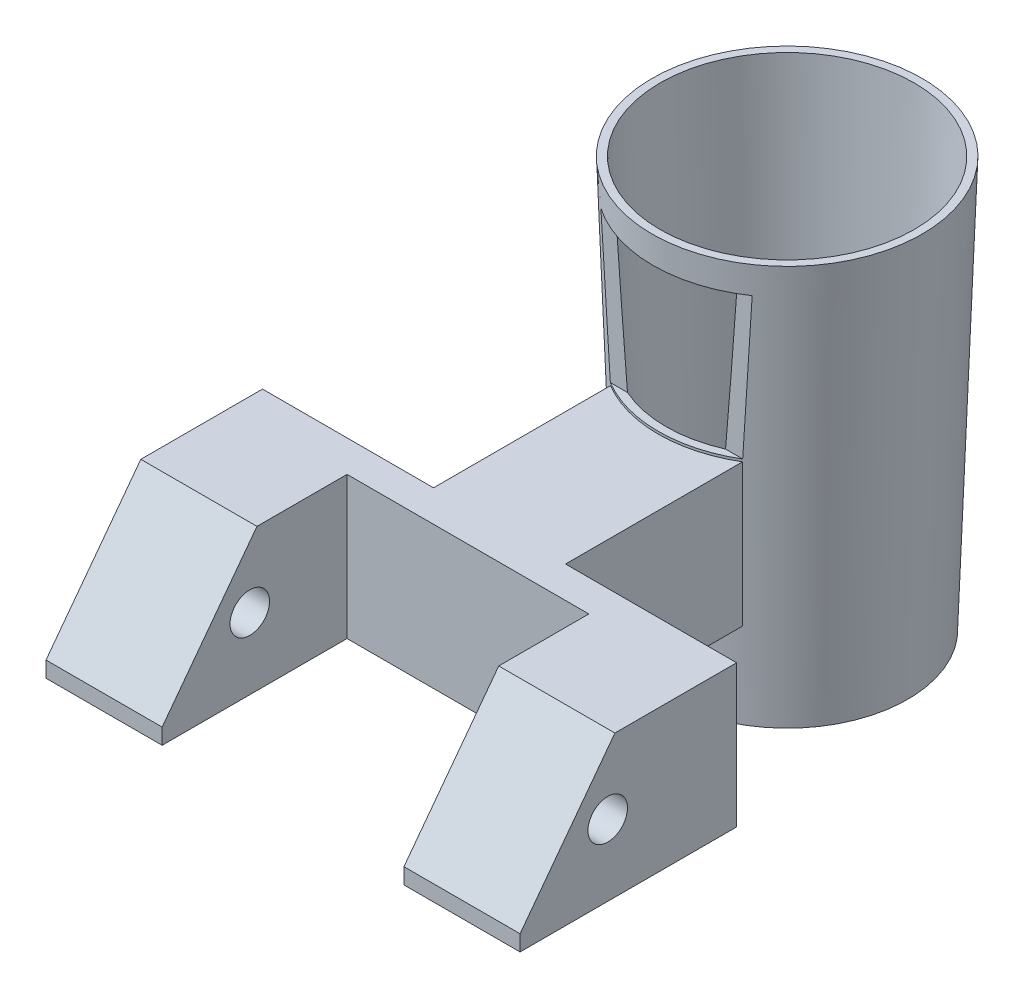
ISO-10303-21;
HEADER;
FILE_DESCRIPTION(('STEP AP214'),'2;1');
FILE_NAME('part.step','',(''),(''),'','','');
FILE_SCHEMA(('AUTOMOTIVE_DESIGN { 1 0 10303 214 1 1 1 1 }'));
ENDSEC;
DATA;
#1=APPLICATION_CONTEXT('core data for automotive mechanical design processes');
#2=APPLICATION_PROTOCOL_DEFINITION('international standard','automotive_design',2000,#1);
#3=PRODUCT_CONTEXT('',#1,'mechanical');
#4=PRODUCT('Part','Part','',(#3));
#5=PRODUCT_RELATED_PRODUCT_CATEGORY('part','',(#4));
#6=PRODUCT_DEFINITION_FORMATION('','',#4);
#7=PRODUCT_DEFINITION_CONTEXT('part definition',#1,'design');
#8=PRODUCT_DEFINITION('design','',#6,#7);
#9=PRODUCT_DEFINITION_SHAPE('','',#8);
#10=(LENGTH_UNIT() NAMED_UNIT(*) SI_UNIT(.MILLI.,.METRE.));
#11=(NAMED_UNIT(*) PLANE_ANGLE_UNIT() SI_UNIT($,.RADIAN.));
#12=(NAMED_UNIT(*) SI_UNIT($,.STERADIAN.) SOLID_ANGLE_UNIT());
#13=UNCERTAINTY_MEASURE_WITH_UNIT(LENGTH_MEASURE(1.E-05),#10,'distance_accuracy_value','');
#14=(GEOMETRIC_REPRESENTATION_CONTEXT(3) GLOBAL_UNCERTAINTY_ASSIGNED_CONTEXT((#13)) GLOBAL_UNIT_ASSIGNED_CONTEXT((#10,
#11,#12)) REPRESENTATION_CONTEXT('',''));
#15=CARTESIAN_POINT('',(0.,0.,0.));
#16=DIRECTION('',(0.,0.,1.));
#17=DIRECTION('',(1.,0.,0.));
#18=AXIS2_PLACEMENT_3D('',#15,#16,#17);
#19=CARTESIAN_POINT('',(0.,0.,0.));
#20=DIRECTION('',(0.,1.,0.));
#21=DIRECTION('',(0.,0.,1.));
#22=AXIS2_PLACEMENT_3D('',#19,#20,#21);
#23=CONICAL_SURFACE('',#22,7.635,0.0349065850398867);
#24=CARTESIAN_POINT('',(0.,0.,0.));
#25=DIRECTION('',(0.,1.,0.));
#26=DIRECTION('',(0.,0.,1.));
#27=AXIS2_PLACEMENT_3D('',#24,#25,#26);
#28=CIRCLE('',#27,7.635);
#29=CARTESIAN_POINT('',(0.,0.,7.635));
#30=VERTEX_POINT('',#29);
#31=EDGE_CURVE('E326',#30,#30,#28,.T.);
#32=ORIENTED_EDGE('',*,*,#31,.T.);
#33=EDGE_LOOP('',(#32));
#34=FACE_BOUND('',#33,.T.);
#35=CARTESIAN_POINT('',(0.,14.79,0.));
#36=DIRECTION('',(0.,-1.,0.));
#37=DIRECTION('',(1.,0.,0.));
#38=AXIS2_PLACEMENT_3D('',#35,#36,#37);
#39=CIRCLE('',#38,8.15147818078295);
#40=CARTESIAN_POINT('',(4.1769123203367,14.79,7.));
#41=VERTEX_POINT('',#40);
#42=CARTESIAN_POINT('',(-4.1769123203367,14.79,7.));
#43=VERTEX_POINT('',#42);
#44=EDGE_CURVE('E359',#41,#43,#39,.T.);
#45=ORIENTED_EDGE('',*,*,#44,.F.);
#46=CARTESIAN_POINT('',(5.37883442278189,34.1602535875309,7.));
#47=CARTESIAN_POINT('',(5.29746098356204,32.7407242724652,7.));
#48=CARTESIAN_POINT('',(5.21496114594843,31.3212586863056,7.));
#49=CARTESIAN_POINT('',(5.04729290213536,28.4825339602092,7.));
#50=CARTESIAN_POINT('',(4.96212458726724,27.0632748148733,7.));
#51=CARTESIAN_POINT('',(4.78871264399351,24.2251827522536,7.));
#52=CARTESIAN_POINT('',(4.7004695334231,22.8063498034009,7.));
#53=CARTESIAN_POINT('',(4.5203274278199,19.9688678004449,7.));
#54=CARTESIAN_POINT('',(4.4284283107347,18.5502187540698,7.));
#55=CARTESIAN_POINT('',(4.24927470403535,15.8494227541624,7.));
#56=CARTESIAN_POINT('',(4.16242159366316,14.5672492270207,7.));
#57=CARTESIAN_POINT('',(3.98439970388387,12.0032100910948,7.));
#58=CARTESIAN_POINT('',(3.89323095591583,10.7213444801359,7.));
#59=CARTESIAN_POINT('',(3.70559419094412,8.15812844056728,7.));
#60=CARTESIAN_POINT('',(3.60912670275801,6.87677797335663,7.));
#61=CARTESIAN_POINT('',(3.4094893345377,4.31455728837519,7.));
#62=CARTESIAN_POINT('',(3.30631926086852,3.03368708555518,7.));
#63=CARTESIAN_POINT('',(3.14490659315583,1.11268015645343,7.));
#64=CARTESIAN_POINT('',(3.08998097714758,0.47226455013285,7.));
#65=CARTESIAN_POINT('',(2.97752462570052,-0.808335924270768,7.));
#66=CARTESIAN_POINT('',(2.91999390122098,-1.44852079331306,7.));
#67=CARTESIAN_POINT('',(2.80184234342515,-2.72855314208155,7.));
#68=CARTESIAN_POINT('',(2.74122176408497,-3.36840064518408,7.));
#69=CARTESIAN_POINT('',(2.61622206619186,-4.64774020631093,7.));
#70=CARTESIAN_POINT('',(2.55184288938958,-5.28723225867147,7.));
#71=CARTESIAN_POINT('',(2.41836974442101,-6.56598144606362,7.));
#72=CARTESIAN_POINT('',(2.34927392317814,-7.20523838840256,7.));
#73=CARTESIAN_POINT('',(2.20504098782717,-8.48305158098413,7.));
#74=CARTESIAN_POINT('',(2.12990412848987,-9.12160785962603,7.));
#75=CARTESIAN_POINT('',(2.01100265117013,-10.0787662382972,7.));
#76=CARTESIAN_POINT('',(1.97032982218827,-10.3977522569865,7.));
#77=CARTESIAN_POINT('',(1.88649120217191,-11.035392693818,7.));
#78=CARTESIAN_POINT('',(1.84332544795816,-11.3540471167871,7.));
#79=CARTESIAN_POINT('',(1.75396275927731,-11.9909799684747,7.));
#80=CARTESIAN_POINT('',(1.70776540150287,-12.309258338341,7.));
#81=CARTESIAN_POINT('',(1.61145697108661,-12.9452369798296,7.));
#82=CARTESIAN_POINT('',(1.56134570077368,-13.2629372214234,7.));
#83=CARTESIAN_POINT('',(1.50883577184699,-13.5802535875309,7.));
#84=B_SPLINE_CURVE_WITH_KNOTS('',3,(#46,#47,#48,#49,#50,#51,#52,#53,#54,#55,#56,#57,#58,#59,#60,
#61,#62,#63,#64,#65,#66,#67,#68,#69,#70,#71,#72,#73,#74,#75,#76,#77,#78,#79,#80,#81,#82,#83),
.UNSPECIFIED.,.F.,.F.,(4,2,2,2,2,2,2,2,2,2,2,2,2,2,2,2,2,2,4),(0.,4.26558001934516,
8.53101420402291,12.7957334740338,17.0605952374343,20.915924909792,24.7712265007152,
28.626144026788,32.4811729694321,34.40946879116,36.3377565016059,38.2658859678164,
40.1940453233955,42.1229666238718,44.0518066179089,45.0165045711355,45.9811882793169,
46.9460069755262,47.9108744311906),.UNSPECIFIED.);
#85=CARTESIAN_POINT('',(3.52442431796431,5.78999999999999,7.));
#86=VERTEX_POINT('',#85);
#87=EDGE_CURVE('E351',#41,#86,#84,.T.);
#88=ORIENTED_EDGE('',*,*,#87,.T.);
#89=CARTESIAN_POINT('',(0.,5.78999999999999,0.));
#90=DIRECTION('',(0.,1.,0.));
#91=DIRECTION('',(-1.,0.,0.));
#92=AXIS2_PLACEMENT_3D('',#89,#90,#91);
#93=CIRCLE('',#92,7.83719125535722);
#94=CARTESIAN_POINT('',(-3.52442431796282,5.78999999999999,7.));
#95=VERTEX_POINT('',#94);
#96=EDGE_CURVE('E337',#95,#86,#93,.T.);
#97=ORIENTED_EDGE('',*,*,#96,.F.);
#98=CARTESIAN_POINT('',(-1.50883577184698,-13.5802535875309,7.));
#99=CARTESIAN_POINT('',(-1.55602216176977,-13.2952395190284,7.));
#100=CARTESIAN_POINT('',(-1.6012460038336,-13.009910606212,7.));
#101=CARTESIAN_POINT('',(-1.68845756310765,-12.438769396071,7.));
#102=CARTESIAN_POINT('',(-1.7304454142854,-12.1529571192584,7.));
#103=CARTESIAN_POINT('',(-1.85258390689214,-11.2950496117438,7.));
#104=CARTESIAN_POINT('',(-1.92892076121249,-10.7224134874774,7.));
#105=CARTESIAN_POINT('',(-2.0744625602636,-9.57640578603929,7.));
#106=CARTESIAN_POINT('',(-2.14366940961348,-9.00303444691441,7.));
#107=CARTESIAN_POINT('',(-2.27674125561708,-7.85565376218701,7.));
#108=CARTESIAN_POINT('',(-2.34060605472457,-7.28164439378515,7.));
#109=CARTESIAN_POINT('',(-2.46413203313391,-6.13337054447066,7.));
#110=CARTESIAN_POINT('',(-2.52379461250638,-5.55910621328909,7.));
#111=CARTESIAN_POINT('',(-2.63972968578688,-4.41024484261137,7.));
#112=CARTESIAN_POINT('',(-2.69600222628913,-3.83564780779769,7.));
#113=CARTESIAN_POINT('',(-2.86064487696454,-2.11135528700942,7.));
#114=CARTESIAN_POINT('',(-2.96482927116652,-0.961260437099898,7.));
#115=CARTESIAN_POINT('',(-3.1879967669894,1.60209839237247,7.));
#116=CARTESIAN_POINT('',(-3.30493307467981,3.01553863508,7.));
#117=CARTESIAN_POINT('',(-3.52999096306747,5.84312324494056,7.));
#118=CARTESIAN_POINT('',(-3.6381124941587,7.25726761601108,7.));
#119=CARTESIAN_POINT('',(-3.84760644774248,10.0860313034585,7.));
#120=CARTESIAN_POINT('',(-3.94897897598211,11.5006506120445,7.));
#121=CARTESIAN_POINT('',(-4.14637328565409,14.3302628990195,7.));
#122=CARTESIAN_POINT('',(-4.24239506002077,15.7452558778994,7.));
#123=CARTESIAN_POINT('',(-4.43014966945764,18.5766324529857,7.));
#124=CARTESIAN_POINT('',(-4.52187910569587,19.9930162739029,7.));
#125=CARTESIAN_POINT('',(-4.70169923826078,22.8260160401418,7.));
#126=CARTESIAN_POINT('',(-4.78978993028103,24.2426319857363,7.));
#127=CARTESIAN_POINT('',(-4.9628905668092,27.0759951109033,7.));
#128=CARTESIAN_POINT('',(-5.04790063365887,28.4927422830192,7.));
#129=CARTESIAN_POINT('',(-5.2152594465338,31.32638965791,7.));
#130=CARTESIAN_POINT('',(-5.29760820057183,32.7432898602112,7.));
#131=CARTESIAN_POINT('',(-5.37883442278189,34.1602535875309,7.));
#132=B_SPLINE_CURVE_WITH_KNOTS('',3,(#98,#99,#100,#101,#102,#103,#104,#105,#106,#107,#108,#109,
#110,#111,#112,#113,#114,#115,#116,#117,#118,#119,#120,#121,#122,#123,#124,#125,#126,#127,#128,
#129,#130,#131),.UNSPECIFIED.,.F.,.F.,(4,2,2,2,2,2,2,2,2,2,2,2,2,2,2,2,4),(0.,0.866659560095629,
1.73328322186169,3.46631723518571,5.19888710085042,6.93152100774515,8.66357488820031,
10.3956049570943,13.8599729293334,18.1147437473273,22.3695385078106,26.6242665861364,
30.8790002826984,35.1370479167216,39.3951005899882,43.6529839762726,47.9108545415854),.UNSPECIFIED.);
#133=EDGE_CURVE('E329',#95,#43,#132,.T.);
#134=ORIENTED_EDGE('',*,*,#133,.T.);
#135=EDGE_LOOP('',(#45,#88,#97,#134));
#136=FACE_BOUND('',#135,.T.);
#137=CARTESIAN_POINT('',(0.,24.2,0.));
#138=DIRECTION('',(0.,1.,0.));
#139=DIRECTION('',(0.,0.,1.));
#140=AXIS2_PLACEMENT_3D('',#137,#138,#139);
#141=CIRCLE('',#140,8.4800826217003);
#142=CARTESIAN_POINT('',(-4.78662733778841,24.2,7.));
#143=VERTEX_POINT('',#142);
#144=CARTESIAN_POINT('',(4.78662733778841,24.2,7.));
#145=VERTEX_POINT('',#144);
#146=EDGE_CURVE('E183',#143,#145,#141,.T.);
#147=ORIENTED_EDGE('',*,*,#146,.T.);
#148=CARTESIAN_POINT('',(5.90903726604226,43.6876697173291,7.));
#149=CARTESIAN_POINT('',(5.82927452718889,42.2144923770276,7.));
#150=CARTESIAN_POINT('',(5.74859060681913,40.7413644553389,7.));
#151=CARTESIAN_POINT('',(5.58508775728723,37.7952366223781,7.));
#152=CARTESIAN_POINT('',(5.50226884178508,36.3222367103475,7.));
#153=CARTESIAN_POINT('',(5.33420688243076,33.3764547842505,7.));
#154=CARTESIAN_POINT('',(5.24896396976119,31.903672762712,7.));
#155=CARTESIAN_POINT('',(5.07566921503719,28.9582636812261,7.));
#156=CARTESIAN_POINT('',(4.98761735399094,27.4856366223941,7.));
#157=CARTESIAN_POINT('',(4.8203146257254,24.7390115899212,7.));
#158=CARTESIAN_POINT('',(4.74147669383163,23.4649884891984,7.));
#159=CARTESIAN_POINT('',(4.58094815703255,20.9171223909377,7.));
#160=CARTESIAN_POINT('',(4.49925755374465,19.6432793932982,7.));
#161=CARTESIAN_POINT('',(4.33252718689738,17.0958335753812,7.));
#162=CARTESIAN_POINT('',(4.24748747948795,15.8222307514364,7.));
#163=CARTESIAN_POINT('',(4.0734086452245,13.2752939924323,7.));
#164=CARTESIAN_POINT('',(3.98436950717787,12.0019600581355,7.));
#165=CARTESIAN_POINT('',(3.80140844295532,9.45551147882899,7.));
#166=CARTESIAN_POINT('',(3.70748601936418,8.1823968694638,7.));
#167=CARTESIAN_POINT('',(3.51355980631857,5.63663733657636,7.));
#168=CARTESIAN_POINT('',(3.41355606482392,4.36399240942961,7.));
#169=CARTESIAN_POINT('',(3.2576258747578,2.45546916034638,7.));
#170=CARTESIAN_POINT('',(3.20465995823647,1.81934879237473,7.));
#171=CARTESIAN_POINT('',(3.09642880568784,0.547304716577795,7.));
#172=CARTESIAN_POINT('',(3.04116357483892,-0.0886189916871519,7.));
#173=CARTESIAN_POINT('',(2.92794649583294,-1.36024496158976,7.));
#174=CARTESIAN_POINT('',(2.8699945777267,-1.99594721702717,7.));
#175=CARTESIAN_POINT('',(2.75084107936115,-3.26705157522272,7.));
#176=CARTESIAN_POINT('',(2.68963947398039,-3.9024536756222,7.));
#177=CARTESIAN_POINT('',(2.62653127668727,-4.53766971732903,7.));
#178=B_SPLINE_CURVE_WITH_KNOTS('',3,(#148,#149,#150,#151,#152,#153,#154,#155,#156,#157,#158,
#159,#160,#161,#162,#163,#164,#165,#166,#167,#168,#169,#170,#171,#172,#173,#174,#175,#176,#177),
.UNSPECIFIED.,.F.,.F.,(4,2,2,2,2,2,2,2,2,2,2,2,2,2,4),(0.,4.42600560504965,8.85198289893749,
13.2777211206273,17.7034892718863,21.5328667632259,25.3622420834158,29.1915532289077,
33.0208750915918,36.850587779039,40.6802702676741,42.5952318236067,44.5101890670106,
46.4251961952746,48.3402181295122),.UNSPECIFIED.);
#179=CARTESIAN_POINT('',(4.1878058258403,14.95,7.));
#180=VERTEX_POINT('',#179);
#181=EDGE_CURVE('E222',#145,#180,#178,.T.);
#182=ORIENTED_EDGE('',*,*,#181,.T.);
#183=CARTESIAN_POINT('',(0.,14.95,0.));
#184=DIRECTION('',(0.,1.,0.));
#185=DIRECTION('',(0.,0.,1.));
#186=AXIS2_PLACEMENT_3D('',#183,#184,#185);
#187=CIRCLE('',#186,8.15706550390163);
#188=CARTESIAN_POINT('',(-4.1878058258403,14.95,7.));
#189=VERTEX_POINT('',#188);
#190=EDGE_CURVE('E229',#189,#180,#187,.T.);
#191=ORIENTED_EDGE('',*,*,#190,.F.);
#192=CARTESIAN_POINT('',(-2.62653127668727,-4.53766971732904,7.));
#193=CARTESIAN_POINT('',(-2.68607058392794,-3.93845739943373,7.));
#194=CARTESIAN_POINT('',(-2.74390243650488,-3.33907856182433,7.));
#195=CARTESIAN_POINT('',(-2.85664456223595,-2.14004992826851,7.));
#196=CARTESIAN_POINT('',(-2.91155485546768,-1.54040013421273,7.));
#197=CARTESIAN_POINT('',(-3.0726417715624,0.258843684971118,7.));
#198=CARTESIAN_POINT('',(-3.17517748029637,1.45876336108969,7.));
#199=CARTESIAN_POINT('',(-3.3730121623862,3.85910475639119,7.));
#200=CARTESIAN_POINT('',(-3.46831166537692,5.0595264323524,7.));
#201=CARTESIAN_POINT('',(-3.65325816417285,7.46081322794196,7.));
#202=CARTESIAN_POINT('',(-3.74290511475023,8.66167835104116,7.));
#203=CARTESIAN_POINT('',(-3.93272452098877,11.2709094087475,7.));
#204=CARTESIAN_POINT('',(-4.0320451810046,12.6793371237031,7.));
#205=CARTESIAN_POINT('',(-4.22567968705454,15.4965373624124,7.));
#206=CARTESIAN_POINT('',(-4.31999352465027,16.9053098867432,7.));
#207=CARTESIAN_POINT('',(-4.59682171099864,21.1320431314302,7.));
#208=CARTESIAN_POINT('',(-4.77322167387813,23.9504046663204,7.));
#209=CARTESIAN_POINT('',(-5.02914713349657,28.1787237861839,7.));
#210=CARTESIAN_POINT('',(-5.11301719578763,29.5884228026679,7.));
#211=CARTESIAN_POINT('',(-5.27822389296497,32.4079703311838,7.));
#212=CARTESIAN_POINT('',(-5.35956052687596,33.817818843273,7.));
#213=CARTESIAN_POINT('',(-5.52003430279725,36.63760700688,7.));
#214=CARTESIAN_POINT('',(-5.59917149709902,38.0475466554309,7.));
#215=CARTESIAN_POINT('',(-5.75550042516701,40.8675322550092,7.));
#216=CARTESIAN_POINT('',(-5.83269216114003,42.2775782059142,7.));
#217=CARTESIAN_POINT('',(-5.90903726604248,43.6876697173291,7.));
#218=B_SPLINE_CURVE_WITH_KNOTS('',3,(#192,#193,#194,#195,#196,#197,#198,#199,#200,#201,#202,
#203,#204,#205,#206,#207,#208,#209,#210,#211,#212,#213,#214,#215,#216,#217),.UNSPECIFIED.,.F.,
.F.,(4,2,2,2,2,2,2,2,2,2,2,2,4),(0.,1.80648197496649,3.61295153379343,7.22579656697551,
10.838376912155,14.4509861590413,18.6867507044866,22.9225223885524,31.3941104405834,
35.6306847424603,39.8672606752886,44.1037357976077,48.3402061141009),.UNSPECIFIED.);
#219=EDGE_CURVE('E216',#189,#143,#218,.T.);
#220=ORIENTED_EDGE('',*,*,#219,.T.);
#221=EDGE_LOOP('',(#147,#182,#191,#220));
#222=FACE_BOUND('',#221,.T.);
#223=CARTESIAN_POINT('',(0.,25.95,0.));
#224=DIRECTION('',(0.,1.,0.));
#225=DIRECTION('',(0.,0.,1.));
#226=AXIS2_PLACEMENT_3D('',#223,#224,#225);
#227=CIRCLE('',#226,8.54119396831085);
#228=CARTESIAN_POINT('',(0.,25.95,8.54119396831085));
#229=VERTEX_POINT('',#228);
#230=EDGE_CURVE('E429',#229,#229,#227,.T.);
#231=ORIENTED_EDGE('',*,*,#230,.F.);
#232=EDGE_LOOP('',(#231));
#233=FACE_BOUND('',#232,.T.);
#234=ADVANCED_FACE('F41',(#34,#136,#222,#233),#23,.T.);
#235=CARTESIAN_POINT('',(0.,0.,0.));
#236=DIRECTION('',(0.,1.,0.));
#237=DIRECTION('',(0.,0.,-1.));
#238=AXIS2_PLACEMENT_3D('',#235,#236,#237);
#239=CONICAL_SURFACE('',#238,7.135,0.0349065850398867);
#240=CARTESIAN_POINT('',(0.,0.,0.));
#241=DIRECTION('',(0.,-1.,0.));
#242=DIRECTION('',(0.,0.,-1.));
#243=AXIS2_PLACEMENT_3D('',#240,#241,#242);
#244=CIRCLE('',#243,7.135);
#245=CARTESIAN_POINT('',(0.,0.,-7.135));
#246=VERTEX_POINT('',#245);
#247=EDGE_CURVE('E301',#246,#246,#244,.T.);
#248=ORIENTED_EDGE('',*,*,#247,.T.);
#249=EDGE_LOOP('',(#248));
#250=FACE_BOUND('',#249,.T.);
#251=CARTESIAN_POINT('',(0.,24.2,0.));
#252=DIRECTION('',(0.,1.,0.));
#253=DIRECTION('',(0.,0.,1.));
#254=AXIS2_PLACEMENT_3D('',#251,#252,#253);
#255=CIRCLE('',#254,7.9800826217003);
#256=CARTESIAN_POINT('',(3.83167308745973,24.2,7.));
#257=VERTEX_POINT('',#256);
#258=CARTESIAN_POINT('',(-3.83167308745971,24.2,7.));
#259=VERTEX_POINT('',#258);
#260=EDGE_CURVE('E50',#257,#259,#255,.F.);
#261=ORIENTED_EDGE('',*,*,#260,.T.);
#262=CARTESIAN_POINT('',(-5.11666877866556,43.9754736716612,7.));
#263=CARTESIAN_POINT('',(-5.03417828983914,42.5818487224281,7.));
#264=CARTESIAN_POINT('',(-4.95043234100004,41.1882969203125,7.));
#265=CARTESIAN_POINT('',(-4.77991886640762,38.4013690833985,7.));
#266=CARTESIAN_POINT('',(-4.69315132059315,37.0079930498288,7.));
#267=CARTESIAN_POINT('',(-4.5160435329219,34.2208109424071,7.));
#268=CARTESIAN_POINT('',(-4.4257016336801,32.8270049735748,7.));
#269=CARTESIAN_POINT('',(-4.24077681623447,30.0396789378694,7.));
#270=CARTESIAN_POINT('',(-4.14619391427884,28.6461588699216,7.));
#271=CARTESIAN_POINT('',(-3.95184081113525,25.8594649117255,7.));
#272=CARTESIAN_POINT('',(-3.85207055667136,24.4662910251803,7.));
#273=CARTESIAN_POINT('',(-3.6460192403796,21.680407559475,7.));
#274=CARTESIAN_POINT('',(-3.539738112545,20.2876979851658,7.));
#275=CARTESIAN_POINT('',(-3.31873132501089,17.5034340769784,7.));
#276=CARTESIAN_POINT('',(-3.20400861741535,16.1118795097274,7.));
#277=CARTESIAN_POINT('',(-2.96305291648762,13.3297866050293,7.));
#278=CARTESIAN_POINT('',(-2.83682023249379,11.9392482412828,7.));
#279=CARTESIAN_POINT('',(-2.63464344133439,9.8547276212309,7.));
#280=CARTESIAN_POINT('',(-2.56511564697109,9.16012410987599,7.));
#281=CARTESIAN_POINT('',(-2.42057982307696,7.77145349654154,7.));
#282=CARTESIAN_POINT('',(-2.3455715681567,7.07738641781093,7.));
#283=CARTESIAN_POINT('',(-2.18825961340254,5.68948772278251,7.));
#284=CARTESIAN_POINT('',(-2.10594986088908,4.99565678960218,7.));
#285=CARTESIAN_POINT('',(-1.93128093384789,3.60930370265913,7.));
#286=CARTESIAN_POINT('',(-1.83892283101782,2.91678141732327,7.));
#287=CARTESIAN_POINT('',(-1.68859170257032,1.87929462877397,7.));
#288=CARTESIAN_POINT('',(-1.63648220748541,1.53348277251955,7.));
#289=CARTESIAN_POINT('',(-1.52704244911602,0.842607241864959,7.));
#290=CARTESIAN_POINT('',(-1.46971121899624,0.497543718181638,7.));
#291=CARTESIAN_POINT('',(-1.34786569763911,-0.190787764498165,7.));
#292=CARTESIAN_POINT('',(-1.28336215940785,-0.534057624734358,7.));
#293=CARTESIAN_POINT('',(-1.14359131443542,-1.21837440849487,7.));
#294=CARTESIAN_POINT('',(-1.06832822000585,-1.55942214759035,7.));
#295=CARTESIAN_POINT('',(-0.946978553776577,-2.04242476096203,7.));
#296=CARTESIAN_POINT('',(-0.90891613799513,-2.18637898068216,7.));
#297=CARTESIAN_POINT('',(-0.827641282185499,-2.47302533097029,7.));
#298=CARTESIAN_POINT('',(-0.784423469368128,-2.61571597540475,7.));
#299=CARTESIAN_POINT('',(-0.702053630808244,-2.86273267848493,7.));
#300=CARTESIAN_POINT('',(-0.664640177432231,-2.96762980483337,7.));
#301=CARTESIAN_POINT('',(-0.583273434433754,-3.17463432869664,7.));
#302=CARTESIAN_POINT('',(-0.53933649312213,-3.27674796560979,7.));
#303=CARTESIAN_POINT('',(-0.454171880086386,-3.44701074247862,7.));
#304=CARTESIAN_POINT('',(-0.415787452089309,-3.5164947650084,7.));
#305=CARTESIAN_POINT('',(-0.348445550716391,-3.61883113246573,7.));
#306=CARTESIAN_POINT('',(-0.323090184408978,-3.65402335756155,7.));
#307=CARTESIAN_POINT('',(-0.267909401946419,-3.72070658570461,7.));
#308=CARTESIAN_POINT('',(-0.23810802108945,-3.75221595776443,7.));
#309=CARTESIAN_POINT('',(-0.191674243598371,-3.79111652796179,7.));
#310=CARTESIAN_POINT('',(-0.177755917768095,-3.80170342462956,7.));
#311=CARTESIAN_POINT('',(-0.148700262564743,-3.82110442927483,7.));
#312=CARTESIAN_POINT('',(-0.133562480274437,-3.8299178742856,7.));
#313=CARTESIAN_POINT('',(-0.101843877070575,-3.84519914831173,7.));
#314=CARTESIAN_POINT('',(-0.0852456310845947,-3.85163192751516,7.));
#315=CARTESIAN_POINT('',(-0.051121907425573,-3.86113825415337,7.));
#316=CARTESIAN_POINT('',(-0.0335991708672691,-3.86422120499276,7.));
#317=CARTESIAN_POINT('',(-0.000325235230056778,-3.86639424052118,7.));
#318=CARTESIAN_POINT('',(0.0153987139210061,-3.86590162249542,7.));
#319=CARTESIAN_POINT('',(0.0464791481731649,-3.86197091046338,7.));
#320=CARTESIAN_POINT('',(0.0618351682627628,-3.85852927233564,7.));
#321=CARTESIAN_POINT('',(0.0945616651476857,-3.84825251184257,7.));
#322=CARTESIAN_POINT('',(0.11176575147456,-3.84089973961769,7.));
#323=CARTESIAN_POINT('',(0.14479044822671,-3.82357754402476,7.));
#324=CARTESIAN_POINT('',(0.160608139537085,-3.81360276840934,7.));
#325=CARTESIAN_POINT('',(0.202618124645821,-3.78342113880434,7.));
#326=CARTESIAN_POINT('',(0.227385524937116,-3.76126250209628,7.));
#327=CARTESIAN_POINT('',(0.273690197049849,-3.713825871504,7.));
#328=CARTESIAN_POINT('',(0.295216446101029,-3.68853774305385,7.));
#329=CARTESIAN_POINT('',(0.348994454727748,-3.61922041520392,7.));
#330=CARTESIAN_POINT('',(0.379204511302802,-3.57362713937133,7.));
#331=CARTESIAN_POINT('',(0.435492302983211,-3.47992179076759,7.));
#332=CARTESIAN_POINT('',(0.461559156969842,-3.43180351306297,7.));
#333=CARTESIAN_POINT('',(0.535693538987555,-3.28482876781454,7.));
#334=CARTESIAN_POINT('',(0.579401544433079,-3.1837961274704,7.));
#335=CARTESIAN_POINT('',(0.667254810653851,-2.96169658497156,7.));
#336=CARTESIAN_POINT('',(0.710180256940603,-2.84017472173018,7.));
#337=CARTESIAN_POINT('',(0.79040634040045,-2.59526263721477,7.));
#338=CARTESIAN_POINT('',(0.82770498353279,-2.47187177056517,7.));
#339=CARTESIAN_POINT('',(0.934015872790759,-2.09952646010261,7.));
#340=CARTESIAN_POINT('',(0.997249653420493,-1.84894641857923,7.));
#341=CARTESIAN_POINT('',(1.11488063765336,-1.34604677382524,7.));
#342=CARTESIAN_POINT('',(1.16928578278263,-1.09372894917737,7.));
#343=CARTESIAN_POINT('',(1.27203693930858,-0.58821764902708,7.));
#344=CARTESIAN_POINT('',(1.32039089158631,-0.335025778838137,7.));
#345=CARTESIAN_POINT('',(1.45838602909781,0.421936210450084,7.));
#346=CARTESIAN_POINT('',(1.54177276241603,0.92683527977775,7.));
#347=CARTESIAN_POINT('',(1.69834271722101,1.93823316943329,7.));
#348=CARTESIAN_POINT('',(1.77152458271177,2.44473219323198,7.));
#349=CARTESIAN_POINT('',(1.91079063479054,3.45915220312167,7.));
#350=CARTESIAN_POINT('',(1.9768685434427,3.96707404648781,7.));
#351=CARTESIAN_POINT('',(2.10371094053635,4.98354469158088,7.));
#352=CARTESIAN_POINT('',(2.1644757314045,5.4920934559498,7.));
#353=CARTESIAN_POINT('',(2.28181082832945,6.50917056611662,7.));
#354=CARTESIAN_POINT('',(2.33838516253953,7.01769844926585,7.));
#355=CARTESIAN_POINT('',(2.44820398041911,8.03511906976006,7.));
#356=CARTESIAN_POINT('',(2.50144841729099,8.54401181213108,7.));
#357=CARTESIAN_POINT('',(2.65704148769098,10.0707037779463,7.));
#358=CARTESIAN_POINT('',(2.75529535601849,11.0889199828394,7.));
#359=CARTESIAN_POINT('',(2.96875159600917,13.39372476215,7.));
#360=CARTESIAN_POINT('',(3.081623168064,14.6805267733005,7.));
#361=CARTESIAN_POINT('',(3.29839798924733,17.2548936384263,7.));
#362=CARTESIAN_POINT('',(3.40230113916566,18.5424585006817,7.));
#363=CARTESIAN_POINT('',(3.6033079965918,21.1183264242279,7.));
#364=CARTESIAN_POINT('',(3.7004105969349,22.4066295714536,7.));
#365=CARTESIAN_POINT('',(3.88922576068111,24.9836318672537,7.));
#366=CARTESIAN_POINT('',(3.98093831173327,26.2723310167288,7.));
#367=CARTESIAN_POINT('',(4.24957136667998,30.1389273334599,7.));
#368=CARTESIAN_POINT('',(4.41998367276578,32.7172761571475,7.));
#369=CARTESIAN_POINT('',(4.74867773869352,37.87461920535,7.));
#370=CARTESIAN_POINT('',(4.90696005438522,40.4536133948515,7.));
#371=CARTESIAN_POINT('',(5.07941554132185,43.3470717461905,7.));
#372=CARTESIAN_POINT('',(5.09807458192774,43.6612708142829,7.));
#373=CARTESIAN_POINT('',(5.11666877866556,43.9754736716612,7.));
#374=B_SPLINE_CURVE_WITH_KNOTS('',3,(#262,#263,#264,#265,#266,#267,#268,#269,#270,#271,#272,
#273,#274,#275,#276,#277,#278,#279,#280,#281,#282,#283,#284,#285,#286,#287,#288,#289,#290,#291,
#292,#293,#294,#295,#296,#297,#298,#299,#300,#301,#302,#303,#304,#305,#306,#307,#308,#309,#310,
#311,#312,#313,#314,#315,#316,#317,#318,#319,#320,#321,#322,#323,#324,#325,#326,#327,#328,#329,
#330,#331,#332,#333,#334,#335,#336,#337,#338,#339,#340,#341,#342,#343,#344,#345,#346,#347,#348,
#349,#350,#351,#352,#353,#354,#355,#356,#357,#358,#359,#360,#361,#362,#363,#364,#365,#366,#367,
#368,#369,#370,#371,#372,#373),.UNSPECIFIED.,.F.,.F.,(4,2,2,2,2,2,2,2,2,2,2,2,2,2,2,2,2,2,2,2,2,
2,2,2,2,2,2,2,2,2,2,2,2,2,2,2,2,2,2,2,2,2,2,2,2,2,2,2,2,2,2,2,2,2,2,4),(0.,4.18819369180081,
8.37641519537589,12.5666020257579,16.7567728040055,20.9469866252775,25.1372429336369,
29.3260407692318,33.5147260612279,35.6089346760658,37.7032294658571,39.7992768709452,
41.8951009427444,42.9442236049229,43.9935409148358,45.0413057350052,46.0886614782145,
46.5353093960031,46.9824269308196,47.3164014415864,47.6495526911815,47.8870634562312,
48.0170222618063,48.1463023874983,48.1986655787368,48.2510483086095,48.3041741653741,
48.3571505025566,48.4040524673661,48.4510108779673,48.5068269371678,48.5627578295841,
48.66189520825,48.7613624749175,48.9250106299632,49.0890817085401,49.4188078556059,
49.8052912596497,50.1919113065355,50.9668884485595,51.7411645726644,52.5144137279371,
54.0494302400757,55.5846505272047,57.1212165619955,58.6576950772773,60.1926769225752,
61.7276803353149,64.7964698374869,68.6716555580393,72.5468841410455,76.4227421717355,
80.2986090833526,88.0504849498974,95.802005378571,96.7462632081477),.UNSPECIFIED.);
#375=CARTESIAN_POINT('',(-3.10332920120317,14.95,7.));
#376=VERTEX_POINT('',#375);
#377=EDGE_CURVE('E11',#259,#376,#374,.T.);
#378=ORIENTED_EDGE('',*,*,#377,.T.);
#379=CARTESIAN_POINT('',(0.,14.95,0.));
#380=DIRECTION('',(0.,1.,0.));
#381=DIRECTION('',(0.,0.,1.));
#382=AXIS2_PLACEMENT_3D('',#379,#380,#381);
#383=CIRCLE('',#382,7.65706550390163);
#384=CARTESIAN_POINT('',(3.10332920120317,14.95,7.));
#385=VERTEX_POINT('',#384);
#386=EDGE_CURVE('E189',#385,#376,#383,.F.);
#387=ORIENTED_EDGE('',*,*,#386,.F.);
#388=EDGE_CURVE('E52',#385,#257,#374,.T.);
#389=ORIENTED_EDGE('',*,*,#388,.T.);
#390=EDGE_LOOP('',(#261,#378,#387,#389));
#391=FACE_BOUND('',#390,.T.);
#392=CARTESIAN_POINT('',(0.,25.95,0.));
#393=DIRECTION('',(0.,1.,0.));
#394=DIRECTION('',(0.,0.,1.));
#395=AXIS2_PLACEMENT_3D('',#392,#393,#394);
#396=CIRCLE('',#395,8.04119396831086);
#397=CARTESIAN_POINT('',(0.,25.95,8.04119396831086));
#398=VERTEX_POINT('',#397);
#399=EDGE_CURVE('E45',#398,#398,#396,.F.);
#400=ORIENTED_EDGE('',*,*,#399,.F.);
#401=EDGE_LOOP('',(#400));
#402=FACE_BOUND('',#401,.T.);
#403=ADVANCED_FACE('F187',(#250,#391,#402),#239,.F.);
#404=CARTESIAN_POINT('',(0.,0.,31.9));
#405=DIRECTION('',(0.,0.,-1.));
#406=DIRECTION('',(-1.,0.,0.));
#407=AXIS2_PLACEMENT_3D('',#404,#405,#406);
#408=PLANE('',#407);
#409=DIRECTION('',(0.,1.,0.));
#410=VECTOR('',#409,1.);
#411=CARTESIAN_POINT('',(15.,14.79,31.9));
#412=LINE('',#411,#410);
#413=CARTESIAN_POINT('',(15.,5.79,31.9));
#414=VERTEX_POINT('',#413);
#415=CARTESIAN_POINT('',(15.,6.78999999999999,31.9));
#416=VERTEX_POINT('',#415);
#417=EDGE_CURVE('E305',#414,#416,#412,.T.);
#418=ORIENTED_EDGE('',*,*,#417,.T.);
#419=DIRECTION('',(-1.,0.,0.));
#420=VECTOR('',#419,1.);
#421=CARTESIAN_POINT('',(17.,6.78999999999999,31.9));
#422=LINE('',#421,#420);
#423=CARTESIAN_POINT('',(7.65,6.78999999999999,31.9));
#424=VERTEX_POINT('',#423);
#425=EDGE_CURVE('E247',#416,#424,#422,.T.);
#426=ORIENTED_EDGE('',*,*,#425,.T.);
#427=DIRECTION('',(0.,-1.,0.));
#428=VECTOR('',#427,1.);
#429=CARTESIAN_POINT('',(7.64999999999999,0.,31.9));
#430=LINE('',#429,#428);
#431=CARTESIAN_POINT('',(7.65,5.78999999999999,31.9));
#432=VERTEX_POINT('',#431);
#433=EDGE_CURVE('E362',#424,#432,#430,.T.);
#434=ORIENTED_EDGE('',*,*,#433,.T.);
#435=DIRECTION('',(1.,0.,0.));
#436=VECTOR('',#435,1.);
#437=CARTESIAN_POINT('',(15.,5.79,31.9));
#438=LINE('',#437,#436);
#439=EDGE_CURVE('E311',#432,#414,#438,.T.);
#440=ORIENTED_EDGE('',*,*,#439,.T.);
#441=EDGE_LOOP('',(#418,#426,#434,#440));
#442=FACE_BOUND('',#441,.T.);
#443=ADVANCED_FACE('F436',(#442),#408,.F.);
#444=CARTESIAN_POINT('',(0.,0.,0.));
#445=DIRECTION('',(0.,1.,0.));
#446=DIRECTION('',(0.,0.,1.));
#447=AXIS2_PLACEMENT_3D('',#444,#445,#446);
#448=PLANE('',#447);
#449=ORIENTED_EDGE('',*,*,#247,.F.);
#450=EDGE_LOOP('',(#449));
#451=FACE_BOUND('',#450,.T.);
#452=ORIENTED_EDGE('',*,*,#31,.F.);
#453=EDGE_LOOP('',(#452));
#454=FACE_BOUND('',#453,.T.);
#455=ADVANCED_FACE('F344',(#451,#454),#448,.F.);
#456=CARTESIAN_POINT('',(0.,0.,7.));
#457=DIRECTION('',(0.,0.,-1.));
#458=DIRECTION('',(-1.,0.,0.));
#459=AXIS2_PLACEMENT_3D('',#456,#457,#458);
#460=PLANE('',#459);
#461=DIRECTION('',(0.,1.,0.));
#462=VECTOR('',#461,1.);
#463=CARTESIAN_POINT('',(4.17691232033669,-23.21,7.));
#464=LINE('',#463,#462);
#465=CARTESIAN_POINT('',(4.17691232033669,5.78999999999999,7.));
#466=VERTEX_POINT('',#465);
#467=EDGE_CURVE('E272',#466,#41,#464,.T.);
#468=ORIENTED_EDGE('',*,*,#467,.F.);
#469=DIRECTION('',(1.,0.,0.));
#470=VECTOR('',#469,1.);
#471=CARTESIAN_POINT('',(15.,5.79,7.));
#472=LINE('',#471,#470);
#473=EDGE_CURVE('E304',#86,#466,#472,.T.);
#474=ORIENTED_EDGE('',*,*,#473,.F.);
#475=ORIENTED_EDGE('',*,*,#87,.F.);
#476=EDGE_LOOP('',(#468,#474,#475));
#477=FACE_BOUND('',#476,.T.);
#478=ADVANCED_FACE('F339',(#477),#460,.T.);
#479=DIRECTION('',(0.,1.,0.));
#480=VECTOR('',#479,1.);
#481=CARTESIAN_POINT('',(-4.17691232033671,-23.21,7.));
#482=LINE('',#481,#480);
#483=CARTESIAN_POINT('',(-4.1769123203367,5.78999999999999,7.));
#484=VERTEX_POINT('',#483);
#485=EDGE_CURVE('E256',#484,#43,#482,.T.);
#486=ORIENTED_EDGE('',*,*,#485,.T.);
#487=ORIENTED_EDGE('',*,*,#133,.F.);
#488=EDGE_CURVE('E309',#484,#95,#472,.T.);
#489=ORIENTED_EDGE('',*,*,#488,.F.);
#490=EDGE_LOOP('',(#486,#487,#489));
#491=FACE_BOUND('',#490,.T.);
#492=ADVANCED_FACE('F343',(#491),#460,.T.);
#493=CARTESIAN_POINT('',(15.,14.79,31.9));
#494=DIRECTION('',(-1.,0.,0.));
#495=DIRECTION('',(0.,-1.,0.));
#496=AXIS2_PLACEMENT_3D('',#493,#494,#495);
#497=PLANE('',#496);
#498=CARTESIAN_POINT('',(15.,10.29,26.3537323341686));
#499=DIRECTION('',(-1.,0.,0.));
#500=DIRECTION('',(0.,-1.,0.));
#501=AXIS2_PLACEMENT_3D('',#498,#499,#500);
#502=CIRCLE('',#501,1.25);
#503=CARTESIAN_POINT('',(15.,9.03999999999999,26.3537323341686));
#504=VERTEX_POINT('',#503);
#505=EDGE_CURVE('E238',#504,#504,#502,.T.);
#506=ORIENTED_EDGE('',*,*,#505,.T.);
#507=EDGE_LOOP('',(#506));
#508=FACE_BOUND('',#507,.T.);
#509=DIRECTION('',(0.,0.,-1.));
#510=VECTOR('',#509,1.);
#511=CARTESIAN_POINT('',(15.,14.79,31.9));
#512=LINE('',#511,#510);
#513=CARTESIAN_POINT('',(15.,14.79,25.9));
#514=VERTEX_POINT('',#513);
#515=CARTESIAN_POINT('',(15.,14.79,18.2));
#516=VERTEX_POINT('',#515);
#517=EDGE_CURVE('E324',#514,#516,#512,.T.);
#518=ORIENTED_EDGE('',*,*,#517,.F.);
#519=DIRECTION('',(0.,-0.8,0.6));
#520=VECTOR('',#519,1.);
#521=CARTESIAN_POINT('',(15.,11.91,28.06));
#522=LINE('',#521,#520);
#523=EDGE_CURVE('E253',#514,#416,#522,.T.);
#524=ORIENTED_EDGE('',*,*,#523,.T.);
#525=ORIENTED_EDGE('',*,*,#417,.F.);
#526=DIRECTION('',(0.,0.,-1.));
#527=VECTOR('',#526,1.);
#528=CARTESIAN_POINT('',(15.,5.79,31.9));
#529=LINE('',#528,#527);
#530=CARTESIAN_POINT('',(15.,5.79,18.2));
#531=VERTEX_POINT('',#530);
#532=EDGE_CURVE('E315',#414,#531,#529,.T.);
#533=ORIENTED_EDGE('',*,*,#532,.T.);
#534=DIRECTION('',(0.,1.,0.));
#535=VECTOR('',#534,1.);
#536=CARTESIAN_POINT('',(15.,-23.21,18.2));
#537=LINE('',#536,#535);
#538=EDGE_CURVE('E277',#531,#516,#537,.T.);
#539=ORIENTED_EDGE('',*,*,#538,.T.);
#540=EDGE_LOOP('',(#518,#524,#525,#533,#539));
#541=FACE_BOUND('',#540,.T.);
#542=ADVANCED_FACE('F450',(#508,#541),#497,.F.);
#543=CARTESIAN_POINT('',(15.,14.79,31.9));
#544=DIRECTION('',(0.,-1.,0.));
#545=DIRECTION('',(1.,0.,0.));
#546=AXIS2_PLACEMENT_3D('',#543,#544,#545);
#547=PLANE('',#546);
#548=DIRECTION('',(0.,0.,-1.));
#549=VECTOR('',#548,1.);
#550=CARTESIAN_POINT('',(-15.,14.79,31.9));
#551=LINE('',#550,#549);
#552=CARTESIAN_POINT('',(-15.,14.79,25.9));
#553=VERTEX_POINT('',#552);
#554=CARTESIAN_POINT('',(-15.,14.79,18.2));
#555=VERTEX_POINT('',#554);
#556=EDGE_CURVE('E322',#553,#555,#551,.T.);
#557=ORIENTED_EDGE('',*,*,#556,.F.);
#558=DIRECTION('',(-1.,0.,0.));
#559=VECTOR('',#558,1.);
#560=CARTESIAN_POINT('',(17.,14.79,25.9));
#561=LINE('',#560,#559);
#562=CARTESIAN_POINT('',(-7.65,14.79,25.9));
#563=VERTEX_POINT('',#562);
#564=EDGE_CURVE('E243',#563,#553,#561,.T.);
#565=ORIENTED_EDGE('',*,*,#564,.F.);
#566=DIRECTION('',(0.,0.,1.));
#567=VECTOR('',#566,1.);
#568=CARTESIAN_POINT('',(-7.65,14.79,20.2));
#569=LINE('',#568,#567);
#570=CARTESIAN_POINT('',(-7.65,14.79,20.2));
#571=VERTEX_POINT('',#570);
#572=EDGE_CURVE('E260',#571,#563,#569,.T.);
#573=ORIENTED_EDGE('',*,*,#572,.F.);
#574=DIRECTION('',(-1.,0.,0.));
#575=VECTOR('',#574,1.);
#576=CARTESIAN_POINT('',(7.65,14.79,20.2));
#577=LINE('',#576,#575);
#578=CARTESIAN_POINT('',(7.65,14.79,20.2));
#579=VERTEX_POINT('',#578);
#580=EDGE_CURVE('E257',#579,#571,#577,.T.);
#581=ORIENTED_EDGE('',*,*,#580,.F.);
#582=DIRECTION('',(0.,0.,-1.));
#583=VECTOR('',#582,1.);
#584=CARTESIAN_POINT('',(7.65,14.79,31.9));
#585=LINE('',#584,#583);
#586=CARTESIAN_POINT('',(7.65,14.79,25.9));
#587=VERTEX_POINT('',#586);
#588=EDGE_CURVE('E264',#587,#579,#585,.T.);
#589=ORIENTED_EDGE('',*,*,#588,.F.);
#590=EDGE_CURVE('E248',#514,#587,#561,.T.);
#591=ORIENTED_EDGE('',*,*,#590,.F.);
#592=ORIENTED_EDGE('',*,*,#517,.T.);
#593=DIRECTION('',(1.,0.,0.));
#594=VECTOR('',#593,1.);
#595=CARTESIAN_POINT('',(15.,14.79,18.2));
#596=LINE('',#595,#594);
#597=CARTESIAN_POINT('',(4.1769123203367,14.79,18.2));
#598=VERTEX_POINT('',#597);
#599=EDGE_CURVE('E274',#598,#516,#596,.T.);
#600=ORIENTED_EDGE('',*,*,#599,.F.);
#601=DIRECTION('',(0.,0.,1.));
#602=VECTOR('',#601,1.);
#603=CARTESIAN_POINT('',(4.1769123203367,14.79,7.));
#604=LINE('',#603,#602);
#605=EDGE_CURVE('E261',#41,#598,#604,.T.);
#606=ORIENTED_EDGE('',*,*,#605,.F.);
#607=ORIENTED_EDGE('',*,*,#44,.T.);
#608=DIRECTION('',(0.,0.,-1.));
#609=VECTOR('',#608,1.);
#610=CARTESIAN_POINT('',(-4.1769123203367,14.79,7.));
#611=LINE('',#610,#609);
#612=CARTESIAN_POINT('',(-4.1769123203367,14.79,18.2));
#613=VERTEX_POINT('',#612);
#614=EDGE_CURVE('E288',#613,#43,#611,.T.);
#615=ORIENTED_EDGE('',*,*,#614,.F.);
#616=DIRECTION('',(1.,0.,0.));
#617=VECTOR('',#616,1.);
#618=CARTESIAN_POINT('',(-4.1769123203367,14.79,18.2));
#619=LINE('',#618,#617);
#620=EDGE_CURVE('E280',#555,#613,#619,.T.);
#621=ORIENTED_EDGE('',*,*,#620,.F.);
#622=EDGE_LOOP('',(#557,#565,#573,#581,#589,#591,#592,#600,#606,#607,#615,#621));
#623=FACE_BOUND('',#622,.T.);
#624=ADVANCED_FACE('F398',(#623),#547,.F.);
#625=CARTESIAN_POINT('',(-15.,14.79,31.9));
#626=DIRECTION('',(1.,0.,0.));
#627=DIRECTION('',(0.,1.,0.));
#628=AXIS2_PLACEMENT_3D('',#625,#626,#627);
#629=PLANE('',#628);
#630=CARTESIAN_POINT('',(-15.,10.29,26.3537323341686));
#631=DIRECTION('',(-1.,0.,0.));
#632=DIRECTION('',(0.,-1.,0.));
#633=AXIS2_PLACEMENT_3D('',#630,#631,#632);
#634=CIRCLE('',#633,1.25);
#635=CARTESIAN_POINT('',(-15.,9.03999999999999,26.3537323341686));
#636=VERTEX_POINT('',#635);
#637=EDGE_CURVE('E232',#636,#636,#634,.T.);
#638=ORIENTED_EDGE('',*,*,#637,.F.);
#639=EDGE_LOOP('',(#638));
#640=FACE_BOUND('',#639,.T.);
#641=DIRECTION('',(0.,-1.,0.));
#642=VECTOR('',#641,1.);
#643=CARTESIAN_POINT('',(-15.,14.79,31.9));
#644=LINE('',#643,#642);
#645=CARTESIAN_POINT('',(-15.,6.78999999999999,31.9));
#646=VERTEX_POINT('',#645);
#647=CARTESIAN_POINT('',(-15.,5.78999999999999,31.9));
#648=VERTEX_POINT('',#647);
#649=EDGE_CURVE('E308',#646,#648,#644,.T.);
#650=ORIENTED_EDGE('',*,*,#649,.F.);
#651=DIRECTION('',(0.,-0.8,0.6));
#652=VECTOR('',#651,1.);
#653=CARTESIAN_POINT('',(-15.,6.78999999999999,31.9));
#654=LINE('',#653,#652);
#655=EDGE_CURVE('E241',#553,#646,#654,.T.);
#656=ORIENTED_EDGE('',*,*,#655,.F.);
#657=ORIENTED_EDGE('',*,*,#556,.T.);
#658=DIRECTION('',(0.,1.,0.));
#659=VECTOR('',#658,1.);
#660=CARTESIAN_POINT('',(-15.,-23.21,18.2));
#661=LINE('',#660,#659);
#662=CARTESIAN_POINT('',(-15.,5.78999999999999,18.2));
#663=VERTEX_POINT('',#662);
#664=EDGE_CURVE('E285',#663,#555,#661,.T.);
#665=ORIENTED_EDGE('',*,*,#664,.F.);
#666=DIRECTION('',(0.,0.,-1.));
#667=VECTOR('',#666,1.);
#668=CARTESIAN_POINT('',(-15.,5.78999999999999,31.9));
#669=LINE('',#668,#667);
#670=EDGE_CURVE('E319',#648,#663,#669,.T.);
#671=ORIENTED_EDGE('',*,*,#670,.F.);
#672=EDGE_LOOP('',(#650,#656,#657,#665,#671));
#673=FACE_BOUND('',#672,.T.);
#674=ADVANCED_FACE('F403',(#640,#673),#629,.F.);
#675=CARTESIAN_POINT('',(15.,5.79,31.9));
#676=DIRECTION('',(0.,1.,0.));
#677=DIRECTION('',(-1.,0.,0.));
#678=AXIS2_PLACEMENT_3D('',#675,#676,#677);
#679=PLANE('',#678);
#680=ORIENTED_EDGE('',*,*,#439,.F.);
#681=DIRECTION('',(0.,0.,-1.));
#682=VECTOR('',#681,1.);
#683=CARTESIAN_POINT('',(7.65,5.79,31.9));
#684=LINE('',#683,#682);
#685=CARTESIAN_POINT('',(7.64999999999999,5.79,20.2));
#686=VERTEX_POINT('',#685);
#687=EDGE_CURVE('E298',#432,#686,#684,.T.);
#688=ORIENTED_EDGE('',*,*,#687,.T.);
#689=DIRECTION('',(-1.,0.,0.));
#690=VECTOR('',#689,1.);
#691=CARTESIAN_POINT('',(15.,5.79,20.2));
#692=LINE('',#691,#690);
#693=CARTESIAN_POINT('',(-7.65000000000001,5.78999999999999,20.2));
#694=VERTEX_POINT('',#693);
#695=EDGE_CURVE('E376',#686,#694,#692,.T.);
#696=ORIENTED_EDGE('',*,*,#695,.T.);
#697=DIRECTION('',(0.,0.,1.));
#698=VECTOR('',#697,1.);
#699=CARTESIAN_POINT('',(-7.65000000000001,5.78999999999999,31.9));
#700=LINE('',#699,#698);
#701=CARTESIAN_POINT('',(-7.65000000000001,5.78999999999999,31.9));
#702=VERTEX_POINT('',#701);
#703=EDGE_CURVE('E270',#694,#702,#700,.T.);
#704=ORIENTED_EDGE('',*,*,#703,.T.);
#705=EDGE_CURVE('E312',#648,#702,#438,.T.);
#706=ORIENTED_EDGE('',*,*,#705,.F.);
#707=ORIENTED_EDGE('',*,*,#670,.T.);
#708=DIRECTION('',(1.,0.,0.));
#709=VECTOR('',#708,1.);
#710=CARTESIAN_POINT('',(15.,5.79,18.2));
#711=LINE('',#710,#709);
#712=CARTESIAN_POINT('',(-4.1769123203367,5.78999999999999,18.2));
#713=VERTEX_POINT('',#712);
#714=EDGE_CURVE('E364',#663,#713,#711,.T.);
#715=ORIENTED_EDGE('',*,*,#714,.T.);
#716=DIRECTION('',(0.,0.,-1.));
#717=VECTOR('',#716,1.);
#718=CARTESIAN_POINT('',(-4.1769123203367,5.78999999999999,31.9));
#719=LINE('',#718,#717);
#720=EDGE_CURVE('E367',#713,#484,#719,.T.);
#721=ORIENTED_EDGE('',*,*,#720,.T.);
#722=ORIENTED_EDGE('',*,*,#488,.T.);
#723=ORIENTED_EDGE('',*,*,#96,.T.);
#724=ORIENTED_EDGE('',*,*,#473,.T.);
#725=DIRECTION('',(0.,0.,1.));
#726=VECTOR('',#725,1.);
#727=CARTESIAN_POINT('',(4.1769123203367,5.78999999999999,31.9));
#728=LINE('',#727,#726);
#729=CARTESIAN_POINT('',(4.1769123203367,5.78999999999999,18.2));
#730=VERTEX_POINT('',#729);
#731=EDGE_CURVE('E370',#466,#730,#728,.T.);
#732=ORIENTED_EDGE('',*,*,#731,.T.);
#733=DIRECTION('',(1.,0.,0.));
#734=VECTOR('',#733,1.);
#735=CARTESIAN_POINT('',(15.,5.79,18.2));
#736=LINE('',#735,#734);
#737=EDGE_CURVE('E373',#730,#531,#736,.T.);
#738=ORIENTED_EDGE('',*,*,#737,.T.);
#739=ORIENTED_EDGE('',*,*,#532,.F.);
#740=EDGE_LOOP('',(#680,#688,#696,#704,#706,#707,#715,#721,#722,#723,#724,#732,#738,#739));
#741=FACE_BOUND('',#740,.T.);
#742=ADVANCED_FACE('F347',(#741),#679,.F.);
#743=DIRECTION('',(0.,1.,0.));
#744=VECTOR('',#743,1.);
#745=CARTESIAN_POINT('',(-7.65000000000001,0.,31.9));
#746=LINE('',#745,#744);
#747=CARTESIAN_POINT('',(-7.65000000000001,6.79,31.9));
#748=VERTEX_POINT('',#747);
#749=EDGE_CURVE('E358',#702,#748,#746,.T.);
#750=ORIENTED_EDGE('',*,*,#749,.T.);
#751=EDGE_CURVE('E244',#748,#646,#422,.T.);
#752=ORIENTED_EDGE('',*,*,#751,.T.);
#753=ORIENTED_EDGE('',*,*,#649,.T.);
#754=ORIENTED_EDGE('',*,*,#705,.T.);
#755=EDGE_LOOP('',(#750,#752,#753,#754));
#756=FACE_BOUND('',#755,.T.);
#757=ADVANCED_FACE('F346',(#756),#408,.F.);
#758=CARTESIAN_POINT('',(7.64999999999999,-23.21,20.2));
#759=DIRECTION('',(0.,0.,-1.));
#760=DIRECTION('',(-1.,0.,0.));
#761=AXIS2_PLACEMENT_3D('',#758,#759,#760);
#762=PLANE('',#761);
#763=DIRECTION('',(0.,1.,0.));
#764=VECTOR('',#763,1.);
#765=CARTESIAN_POINT('',(7.64999999999999,-23.21,20.2));
#766=LINE('',#765,#764);
#767=EDGE_CURVE('E267',#686,#579,#766,.T.);
#768=ORIENTED_EDGE('',*,*,#767,.T.);
#769=ORIENTED_EDGE('',*,*,#580,.T.);
#770=DIRECTION('',(0.,1.,0.));
#771=VECTOR('',#770,1.);
#772=CARTESIAN_POINT('',(-7.65000000000001,-23.21,20.2));
#773=LINE('',#772,#771);
#774=EDGE_CURVE('E266',#694,#571,#773,.T.);
#775=ORIENTED_EDGE('',*,*,#774,.F.);
#776=ORIENTED_EDGE('',*,*,#695,.F.);
#777=EDGE_LOOP('',(#768,#769,#775,#776));
#778=FACE_BOUND('',#777,.T.);
#779=ADVANCED_FACE('F392',(#778),#762,.F.);
#780=CARTESIAN_POINT('',(7.64999999999999,-23.21,31.9));
#781=DIRECTION('',(1.,0.,0.));
#782=DIRECTION('',(0.,1.,0.));
#783=AXIS2_PLACEMENT_3D('',#780,#781,#782);
#784=PLANE('',#783);
#785=CARTESIAN_POINT('',(7.65,10.29,26.3537323341686));
#786=DIRECTION('',(1.,0.,0.));
#787=DIRECTION('',(0.,1.,0.));
#788=AXIS2_PLACEMENT_3D('',#785,#786,#787);
#789=CIRCLE('',#788,1.25);
#790=CARTESIAN_POINT('',(7.65,11.54,26.3537323341686));
#791=VERTEX_POINT('',#790);
#792=EDGE_CURVE('E235',#791,#791,#789,.T.);
#793=ORIENTED_EDGE('',*,*,#792,.T.);
#794=EDGE_LOOP('',(#793));
#795=FACE_BOUND('',#794,.T.);
#796=ORIENTED_EDGE('',*,*,#433,.F.);
#797=DIRECTION('',(0.,0.8,-0.6));
#798=VECTOR('',#797,1.);
#799=CARTESIAN_POINT('',(7.64999999999999,-12.41,46.3));
#800=LINE('',#799,#798);
#801=EDGE_CURVE('E250',#424,#587,#800,.T.);
#802=ORIENTED_EDGE('',*,*,#801,.T.);
#803=ORIENTED_EDGE('',*,*,#588,.T.);
#804=ORIENTED_EDGE('',*,*,#767,.F.);
#805=ORIENTED_EDGE('',*,*,#687,.F.);
#806=EDGE_LOOP('',(#796,#802,#803,#804,#805));
#807=FACE_BOUND('',#806,.T.);
#808=ADVANCED_FACE('F472',(#795,#807),#784,.F.);
#809=CARTESIAN_POINT('',(-7.65000000000001,-23.21,20.2));
#810=DIRECTION('',(-1.,0.,0.));
#811=DIRECTION('',(0.,-1.,0.));
#812=AXIS2_PLACEMENT_3D('',#809,#810,#811);
#813=PLANE('',#812);
#814=CARTESIAN_POINT('',(-7.65000000000001,10.29,26.3537323341686));
#815=DIRECTION('',(-1.,0.,0.));
#816=DIRECTION('',(0.,-1.,0.));
#817=AXIS2_PLACEMENT_3D('',#814,#815,#816);
#818=CIRCLE('',#817,1.25);
#819=CARTESIAN_POINT('',(-7.65000000000001,9.03999999999999,26.3537323341686));
#820=VERTEX_POINT('',#819);
#821=EDGE_CURVE('E199',#820,#820,#818,.T.);
#822=ORIENTED_EDGE('',*,*,#821,.T.);
#823=EDGE_LOOP('',(#822));
#824=FACE_BOUND('',#823,.T.);
#825=ORIENTED_EDGE('',*,*,#572,.T.);
#826=DIRECTION('',(0.,-0.8,0.6));
#827=VECTOR('',#826,1.);
#828=CARTESIAN_POINT('',(-7.65000000000001,-6.79400000000002,42.088));
#829=LINE('',#828,#827);
#830=EDGE_CURVE('E198',#563,#748,#829,.T.);
#831=ORIENTED_EDGE('',*,*,#830,.T.);
#832=ORIENTED_EDGE('',*,*,#749,.F.);
#833=ORIENTED_EDGE('',*,*,#703,.F.);
#834=ORIENTED_EDGE('',*,*,#774,.T.);
#835=EDGE_LOOP('',(#825,#831,#832,#833,#834));
#836=FACE_BOUND('',#835,.T.);
#837=ADVANCED_FACE('F380',(#824,#836),#813,.F.);
#838=CARTESIAN_POINT('',(-4.17691232033671,-23.21,7.));
#839=DIRECTION('',(1.,0.,0.));
#840=DIRECTION('',(0.,1.,0.));
#841=AXIS2_PLACEMENT_3D('',#838,#839,#840);
#842=PLANE('',#841);
#843=DIRECTION('',(0.,1.,0.));
#844=VECTOR('',#843,1.);
#845=CARTESIAN_POINT('',(-4.17691232033671,-23.21,18.2));
#846=LINE('',#845,#844);
#847=EDGE_CURVE('E289',#713,#613,#846,.T.);
#848=ORIENTED_EDGE('',*,*,#847,.T.);
#849=ORIENTED_EDGE('',*,*,#614,.T.);
#850=ORIENTED_EDGE('',*,*,#485,.F.);
#851=ORIENTED_EDGE('',*,*,#720,.F.);
#852=EDGE_LOOP('',(#848,#849,#850,#851));
#853=FACE_BOUND('',#852,.T.);
#854=ADVANCED_FACE('F412',(#853),#842,.F.);
#855=CARTESIAN_POINT('',(-4.17691232033671,-23.21,18.2));
#856=DIRECTION('',(0.,0.,1.));
#857=DIRECTION('',(1.,0.,0.));
#858=AXIS2_PLACEMENT_3D('',#855,#856,#857);
#859=PLANE('',#858);
#860=ORIENTED_EDGE('',*,*,#664,.T.);
#861=ORIENTED_EDGE('',*,*,#620,.T.);
#862=ORIENTED_EDGE('',*,*,#847,.F.);
#863=ORIENTED_EDGE('',*,*,#714,.F.);
#864=EDGE_LOOP('',(#860,#861,#862,#863));
#865=FACE_BOUND('',#864,.T.);
#866=ADVANCED_FACE('F406',(#865),#859,.F.);
#867=CARTESIAN_POINT('',(15.,-23.21,18.2));
#868=DIRECTION('',(0.,0.,1.));
#869=DIRECTION('',(1.,0.,0.));
#870=AXIS2_PLACEMENT_3D('',#867,#868,#869);
#871=PLANE('',#870);
#872=DIRECTION('',(0.,1.,0.));
#873=VECTOR('',#872,1.);
#874=CARTESIAN_POINT('',(4.17691232033669,-23.21,18.2));
#875=LINE('',#874,#873);
#876=EDGE_CURVE('E275',#730,#598,#875,.T.);
#877=ORIENTED_EDGE('',*,*,#876,.T.);
#878=ORIENTED_EDGE('',*,*,#599,.T.);
#879=ORIENTED_EDGE('',*,*,#538,.F.);
#880=ORIENTED_EDGE('',*,*,#737,.F.);
#881=EDGE_LOOP('',(#877,#878,#879,#880));
#882=FACE_BOUND('',#881,.T.);
#883=ADVANCED_FACE('F487',(#882),#871,.F.);
#884=CARTESIAN_POINT('',(4.17691232033669,-23.21,7.));
#885=DIRECTION('',(-1.,0.,0.));
#886=DIRECTION('',(0.,-1.,0.));
#887=AXIS2_PLACEMENT_3D('',#884,#885,#886);
#888=PLANE('',#887);
#889=ORIENTED_EDGE('',*,*,#467,.T.);
#890=ORIENTED_EDGE('',*,*,#605,.T.);
#891=ORIENTED_EDGE('',*,*,#876,.F.);
#892=ORIENTED_EDGE('',*,*,#731,.F.);
#893=EDGE_LOOP('',(#889,#890,#891,#892));
#894=FACE_BOUND('',#893,.T.);
#895=ADVANCED_FACE('F484',(#894),#888,.F.);
#896=CARTESIAN_POINT('',(17.,6.78999999999999,31.9));
#897=DIRECTION('',(0.,-0.6,-0.8));
#898=DIRECTION('',(0.,0.8,-0.6));
#899=AXIS2_PLACEMENT_3D('',#896,#897,#898);
#900=PLANE('',#899);
#901=ORIENTED_EDGE('',*,*,#564,.T.);
#902=ORIENTED_EDGE('',*,*,#655,.T.);
#903=ORIENTED_EDGE('',*,*,#751,.F.);
#904=ORIENTED_EDGE('',*,*,#830,.F.);
#905=EDGE_LOOP('',(#901,#902,#903,#904));
#906=FACE_BOUND('',#905,.T.);
#907=ADVANCED_FACE('F401',(#906),#900,.F.);
#908=ORIENTED_EDGE('',*,*,#590,.T.);
#909=ORIENTED_EDGE('',*,*,#801,.F.);
#910=ORIENTED_EDGE('',*,*,#425,.F.);
#911=ORIENTED_EDGE('',*,*,#523,.F.);
#912=EDGE_LOOP('',(#908,#909,#910,#911));
#913=FACE_BOUND('',#912,.T.);
#914=ADVANCED_FACE('F466',(#913),#900,.F.);
#915=CARTESIAN_POINT('',(17.,10.29,26.3537323341686));
#916=DIRECTION('',(-1.,0.,0.));
#917=DIRECTION('',(0.,-1.,0.));
#918=AXIS2_PLACEMENT_3D('',#915,#916,#917);
#919=CYLINDRICAL_SURFACE('',#918,1.25);
#920=ORIENTED_EDGE('',*,*,#637,.T.);
#921=EDGE_LOOP('',(#920));
#922=FACE_BOUND('',#921,.T.);
#923=ORIENTED_EDGE('',*,*,#821,.F.);
#924=EDGE_LOOP('',(#923));
#925=FACE_BOUND('',#924,.T.);
#926=ADVANCED_FACE('F462',(#922,#925),#919,.F.);
#927=ORIENTED_EDGE('',*,*,#792,.F.);
#928=EDGE_LOOP('',(#927));
#929=FACE_BOUND('',#928,.T.);
#930=ORIENTED_EDGE('',*,*,#505,.F.);
#931=EDGE_LOOP('',(#930));
#932=FACE_BOUND('',#931,.T.);
#933=ADVANCED_FACE('F465',(#929,#932),#919,.F.);
#934=CARTESIAN_POINT('',(-8.75,24.2,22.));
#935=DIRECTION('',(0.,1.,0.));
#936=DIRECTION('',(0.,0.,1.));
#937=AXIS2_PLACEMENT_3D('',#934,#935,#936);
#938=PLANE('',#937);
#939=DIRECTION('',(1.,0.,0.));
#940=VECTOR('',#939,1.);
#941=CARTESIAN_POINT('',(-8.75,24.2,7.));
#942=LINE('',#941,#940);
#943=EDGE_CURVE('E59',#143,#259,#942,.T.);
#944=ORIENTED_EDGE('',*,*,#943,.T.);
#945=ORIENTED_EDGE('',*,*,#260,.F.);
#946=EDGE_CURVE('E67',#257,#145,#942,.T.);
#947=ORIENTED_EDGE('',*,*,#946,.T.);
#948=ORIENTED_EDGE('',*,*,#146,.F.);
#949=EDGE_LOOP('',(#944,#945,#947,#948));
#950=FACE_BOUND('',#949,.T.);
#951=ADVANCED_FACE('F180',(#950),#938,.F.);
#952=CARTESIAN_POINT('',(-8.75,14.95,22.));
#953=DIRECTION('',(0.,1.,0.));
#954=DIRECTION('',(0.,0.,1.));
#955=AXIS2_PLACEMENT_3D('',#952,#953,#954);
#956=PLANE('',#955);
#957=ORIENTED_EDGE('',*,*,#190,.T.);
#958=DIRECTION('',(1.,0.,0.));
#959=VECTOR('',#958,1.);
#960=CARTESIAN_POINT('',(-8.75,14.95,7.));
#961=LINE('',#960,#959);
#962=EDGE_CURVE('E185',#385,#180,#961,.T.);
#963=ORIENTED_EDGE('',*,*,#962,.F.);
#964=ORIENTED_EDGE('',*,*,#386,.T.);
#965=EDGE_CURVE('E175',#189,#376,#961,.T.);
#966=ORIENTED_EDGE('',*,*,#965,.F.);
#967=EDGE_LOOP('',(#957,#963,#964,#966));
#968=FACE_BOUND('',#967,.T.);
#969=ADVANCED_FACE('F209',(#968),#956,.T.);
#970=CARTESIAN_POINT('',(0.,0.,7.));
#971=DIRECTION('',(0.,0.,-1.));
#972=DIRECTION('',(-1.,0.,0.));
#973=AXIS2_PLACEMENT_3D('',#970,#971,#972);
#974=PLANE('',#973);
#975=ORIENTED_EDGE('',*,*,#946,.F.);
#976=ORIENTED_EDGE('',*,*,#388,.F.);
#977=ORIENTED_EDGE('',*,*,#962,.T.);
#978=ORIENTED_EDGE('',*,*,#181,.F.);
#979=EDGE_LOOP('',(#975,#976,#977,#978));
#980=FACE_BOUND('',#979,.T.);
#981=ADVANCED_FACE('F204',(#980),#974,.F.);
#982=ORIENTED_EDGE('',*,*,#965,.T.);
#983=ORIENTED_EDGE('',*,*,#377,.F.);
#984=ORIENTED_EDGE('',*,*,#943,.F.);
#985=ORIENTED_EDGE('',*,*,#219,.F.);
#986=EDGE_LOOP('',(#982,#983,#984,#985));
#987=FACE_BOUND('',#986,.T.);
#988=ADVANCED_FACE('F173',(#987),#974,.F.);
#989=CARTESIAN_POINT('',(0.,25.95,0.));
#990=DIRECTION('',(0.,1.,0.));
#991=DIRECTION('',(0.,0.,1.));
#992=AXIS2_PLACEMENT_3D('',#989,#990,#991);
#993=PLANE('',#992);
#994=ORIENTED_EDGE('',*,*,#399,.T.);
#995=EDGE_LOOP('',(#994));
#996=FACE_BOUND('',#995,.T.);
#997=ORIENTED_EDGE('',*,*,#230,.T.);
#998=EDGE_LOOP('',(#997));
#999=FACE_BOUND('',#998,.T.);
#1000=ADVANCED_FACE('F210',(#996,#999),#993,.T.);
#1001=CLOSED_SHELL('',(#234,#403,#443,#455,#478,#492,#542,#624,#674,#742,#757,#779,#808,#837,
#854,#866,#883,#895,#907,#914,#926,#933,#951,#969,#981,#988,#1000));
#1002=MANIFOLD_SOLID_BREP('B2',#1001);
#1003=ADVANCED_BREP_SHAPE_REPRESENTATION('',(#18,#1002),#14);
#1004=SHAPE_DEFINITION_REPRESENTATION(#9,#1003);
ENDSEC;
END-ISO-10303-21;
